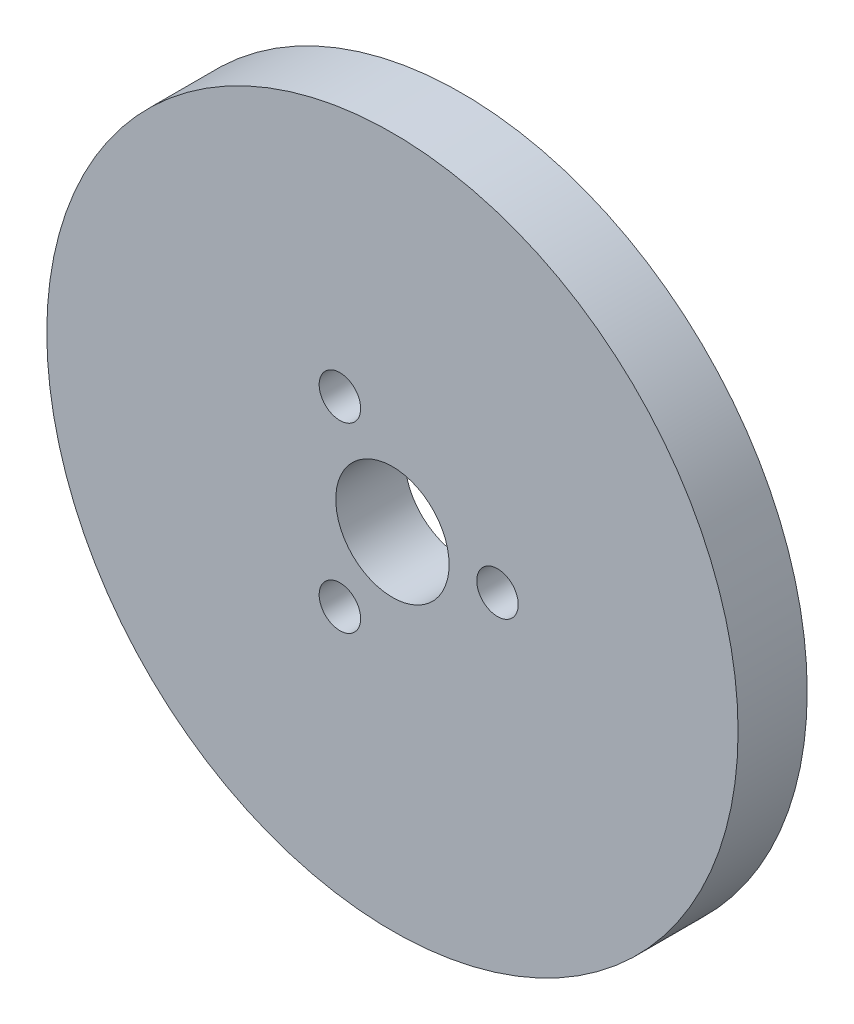
ISO-10303-21;
HEADER;
FILE_DESCRIPTION(('STEP AP214'),'2;1');
FILE_NAME('part.step','',(''),(''),'','','');
FILE_SCHEMA(('AUTOMOTIVE_DESIGN { 1 0 10303 214 1 1 1 1 }'));
ENDSEC;
DATA;
#1=APPLICATION_CONTEXT('core data for automotive mechanical design processes');
#2=APPLICATION_PROTOCOL_DEFINITION('international standard','automotive_design',2000,#1);
#3=PRODUCT_CONTEXT('',#1,'mechanical');
#4=PRODUCT('Part','Part','',(#3));
#5=PRODUCT_RELATED_PRODUCT_CATEGORY('part','',(#4));
#6=PRODUCT_DEFINITION_FORMATION('','',#4);
#7=PRODUCT_DEFINITION_CONTEXT('part definition',#1,'design');
#8=PRODUCT_DEFINITION('design','',#6,#7);
#9=PRODUCT_DEFINITION_SHAPE('','',#8);
#10=(LENGTH_UNIT() NAMED_UNIT(*) SI_UNIT(.MILLI.,.METRE.));
#11=(NAMED_UNIT(*) PLANE_ANGLE_UNIT() SI_UNIT($,.RADIAN.));
#12=(NAMED_UNIT(*) SI_UNIT($,.STERADIAN.) SOLID_ANGLE_UNIT());
#13=UNCERTAINTY_MEASURE_WITH_UNIT(LENGTH_MEASURE(1.E-05),#10,'distance_accuracy_value','');
#14=(GEOMETRIC_REPRESENTATION_CONTEXT(3) GLOBAL_UNCERTAINTY_ASSIGNED_CONTEXT((#13)) GLOBAL_UNIT_ASSIGNED_CONTEXT((#10,
#11,#12)) REPRESENTATION_CONTEXT('',''));
#15=CARTESIAN_POINT('',(0.,0.,0.));
#16=DIRECTION('',(0.,0.,1.));
#17=DIRECTION('',(1.,0.,0.));
#18=AXIS2_PLACEMENT_3D('',#15,#16,#17);
#19=CARTESIAN_POINT('',(-25.4441334366912,-11.5004582691866,26.2397640488421));
#20=DIRECTION('',(0.,0.,1.));
#21=DIRECTION('',(1.,0.,0.));
#22=AXIS2_PLACEMENT_3D('',#19,#20,#21);
#23=PLANE('',#22);
#24=CARTESIAN_POINT('',(-29.2441334366912,-18.0822513379484,26.2397640488421));
#25=DIRECTION('',(0.,0.,1.));
#26=DIRECTION('',(1.,0.,0.));
#27=AXIS2_PLACEMENT_3D('',#24,#25,#26);
#28=CIRCLE('',#27,1.49999999999996);
#29=CARTESIAN_POINT('',(-27.7441334366912,-18.0822513379484,26.2397640488421));
#30=VERTEX_POINT('',#29);
#31=EDGE_CURVE('E47',#30,#30,#28,.T.);
#32=ORIENTED_EDGE('',*,*,#31,.F.);
#33=EDGE_LOOP('',(#32));
#34=FACE_BOUND('',#33,.T.);
#35=CARTESIAN_POINT('',(-25.4441334366912,-11.5004582691866,26.2397640488421));
#36=DIRECTION('',(0.,0.,1.));
#37=DIRECTION('',(1.,0.,0.));
#38=AXIS2_PLACEMENT_3D('',#35,#36,#37);
#39=CIRCLE('',#38,4.1);
#40=CARTESIAN_POINT('',(-21.3441334366912,-11.5004582691866,26.2397640488421));
#41=VERTEX_POINT('',#40);
#42=EDGE_CURVE('E10',#41,#41,#39,.T.);
#43=ORIENTED_EDGE('',*,*,#42,.F.);
#44=EDGE_LOOP('',(#43));
#45=FACE_BOUND('',#44,.T.);
#46=CARTESIAN_POINT('',(-17.8441334366912,-11.5004582691866,26.2397640488421));
#47=DIRECTION('',(0.,0.,1.));
#48=DIRECTION('',(1.,0.,0.));
#49=AXIS2_PLACEMENT_3D('',#46,#47,#48);
#50=CIRCLE('',#49,1.5);
#51=CARTESIAN_POINT('',(-16.3441334366912,-11.5004582691866,26.2397640488421));
#52=VERTEX_POINT('',#51);
#53=EDGE_CURVE('E42',#52,#52,#50,.T.);
#54=ORIENTED_EDGE('',*,*,#53,.F.);
#55=EDGE_LOOP('',(#54));
#56=FACE_BOUND('',#55,.T.);
#57=CARTESIAN_POINT('',(-29.2441334366911,-4.91866520042485,26.2397640488421));
#58=DIRECTION('',(0.,0.,1.));
#59=DIRECTION('',(1.,0.,0.));
#60=AXIS2_PLACEMENT_3D('',#57,#58,#59);
#61=CIRCLE('',#60,1.5);
#62=CARTESIAN_POINT('',(-27.7441334366911,-4.91866520042485,26.2397640488421));
#63=VERTEX_POINT('',#62);
#64=EDGE_CURVE('E53',#63,#63,#61,.T.);
#65=ORIENTED_EDGE('',*,*,#64,.F.);
#66=EDGE_LOOP('',(#65));
#67=FACE_BOUND('',#66,.T.);
#68=CARTESIAN_POINT('',(-25.4441334366912,-11.5004582691866,26.2397640488421));
#69=DIRECTION('',(0.,0.,1.));
#70=DIRECTION('',(1.,0.,0.));
#71=AXIS2_PLACEMENT_3D('',#68,#69,#70);
#72=CIRCLE('',#71,25.);
#73=CARTESIAN_POINT('',(-0.444133436691162,-11.5004582691866,26.2397640488421));
#74=VERTEX_POINT('',#73);
#75=EDGE_CURVE('E59',#74,#74,#72,.T.);
#76=ORIENTED_EDGE('',*,*,#75,.T.);
#77=EDGE_LOOP('',(#76));
#78=FACE_BOUND('',#77,.T.);
#79=ADVANCED_FACE('F31',(#34,#45,#56,#67,#78),#23,.T.);
#80=CARTESIAN_POINT('',(-25.4441334366912,-11.5004582691866,21.2397640488421));
#81=DIRECTION('',(0.,0.,1.));
#82=DIRECTION('',(1.,0.,0.));
#83=AXIS2_PLACEMENT_3D('',#80,#81,#82);
#84=PLANE('',#83);
#85=CARTESIAN_POINT('',(-25.4441334366912,-11.5004582691866,21.2397640488421));
#86=DIRECTION('',(0.,0.,1.));
#87=DIRECTION('',(1.,0.,0.));
#88=AXIS2_PLACEMENT_3D('',#85,#86,#87);
#89=CIRCLE('',#88,4.1);
#90=CARTESIAN_POINT('',(-21.3441334366912,-11.5004582691866,21.2397640488421));
#91=VERTEX_POINT('',#90);
#92=EDGE_CURVE('E35',#91,#91,#89,.T.);
#93=ORIENTED_EDGE('',*,*,#92,.T.);
#94=EDGE_LOOP('',(#93));
#95=FACE_BOUND('',#94,.T.);
#96=CARTESIAN_POINT('',(-17.8441334366912,-11.5004582691866,21.2397640488421));
#97=DIRECTION('',(0.,0.,1.));
#98=DIRECTION('',(1.,0.,0.));
#99=AXIS2_PLACEMENT_3D('',#96,#97,#98);
#100=CIRCLE('',#99,1.5);
#101=CARTESIAN_POINT('',(-16.3441334366912,-11.5004582691866,21.2397640488421));
#102=VERTEX_POINT('',#101);
#103=EDGE_CURVE('E44',#102,#102,#100,.T.);
#104=ORIENTED_EDGE('',*,*,#103,.T.);
#105=EDGE_LOOP('',(#104));
#106=FACE_BOUND('',#105,.T.);
#107=CARTESIAN_POINT('',(-29.2441334366912,-18.0822513379484,21.2397640488421));
#108=DIRECTION('',(0.,0.,1.));
#109=DIRECTION('',(1.,0.,0.));
#110=AXIS2_PLACEMENT_3D('',#107,#108,#109);
#111=CIRCLE('',#110,1.49999999999996);
#112=CARTESIAN_POINT('',(-27.7441334366912,-18.0822513379484,21.2397640488421));
#113=VERTEX_POINT('',#112);
#114=EDGE_CURVE('E50',#113,#113,#111,.T.);
#115=ORIENTED_EDGE('',*,*,#114,.T.);
#116=EDGE_LOOP('',(#115));
#117=FACE_BOUND('',#116,.T.);
#118=CARTESIAN_POINT('',(-29.2441334366911,-4.91866520042485,21.2397640488421));
#119=DIRECTION('',(0.,0.,1.));
#120=DIRECTION('',(1.,0.,0.));
#121=AXIS2_PLACEMENT_3D('',#118,#119,#120);
#122=CIRCLE('',#121,1.5);
#123=CARTESIAN_POINT('',(-27.7441334366911,-4.91866520042485,21.2397640488421));
#124=VERTEX_POINT('',#123);
#125=EDGE_CURVE('E56',#124,#124,#122,.T.);
#126=ORIENTED_EDGE('',*,*,#125,.T.);
#127=EDGE_LOOP('',(#126));
#128=FACE_BOUND('',#127,.T.);
#129=CARTESIAN_POINT('',(-25.4441334366912,-11.5004582691866,21.2397640488421));
#130=DIRECTION('',(0.,0.,1.));
#131=DIRECTION('',(1.,0.,0.));
#132=AXIS2_PLACEMENT_3D('',#129,#130,#131);
#133=CIRCLE('',#132,25.);
#134=CARTESIAN_POINT('',(-0.444133436691162,-11.5004582691866,21.2397640488421));
#135=VERTEX_POINT('',#134);
#136=EDGE_CURVE('E62',#135,#135,#133,.T.);
#137=ORIENTED_EDGE('',*,*,#136,.F.);
#138=EDGE_LOOP('',(#137));
#139=FACE_BOUND('',#138,.T.);
#140=ADVANCED_FACE('F33',(#95,#106,#117,#128,#139),#84,.F.);
#141=CARTESIAN_POINT('',(-25.4441334366912,-11.5004582691866,26.2397640488421));
#142=DIRECTION('',(0.,0.,-1.));
#143=DIRECTION('',(-1.,0.,0.));
#144=AXIS2_PLACEMENT_3D('',#141,#142,#143);
#145=CYLINDRICAL_SURFACE('',#144,4.1);
#146=ORIENTED_EDGE('',*,*,#42,.T.);
#147=EDGE_LOOP('',(#146));
#148=FACE_BOUND('',#147,.T.);
#149=ORIENTED_EDGE('',*,*,#92,.F.);
#150=EDGE_LOOP('',(#149));
#151=FACE_BOUND('',#150,.T.);
#152=ADVANCED_FACE('F86',(#148,#151),#145,.F.);
#153=CARTESIAN_POINT('',(-17.8441334366912,-11.5004582691866,26.2397640488421));
#154=DIRECTION('',(0.,0.,-1.));
#155=DIRECTION('',(-1.,0.,0.));
#156=AXIS2_PLACEMENT_3D('',#153,#154,#155);
#157=CYLINDRICAL_SURFACE('',#156,1.5);
#158=ORIENTED_EDGE('',*,*,#53,.T.);
#159=EDGE_LOOP('',(#158));
#160=FACE_BOUND('',#159,.T.);
#161=ORIENTED_EDGE('',*,*,#103,.F.);
#162=EDGE_LOOP('',(#161));
#163=FACE_BOUND('',#162,.T.);
#164=ADVANCED_FACE('F93',(#160,#163),#157,.F.);
#165=CARTESIAN_POINT('',(-29.2441334366912,-18.0822513379484,26.2397640488421));
#166=DIRECTION('',(0.,0.,-1.));
#167=DIRECTION('',(-1.,0.,0.));
#168=AXIS2_PLACEMENT_3D('',#165,#166,#167);
#169=CYLINDRICAL_SURFACE('',#168,1.49999999999996);
#170=ORIENTED_EDGE('',*,*,#31,.T.);
#171=EDGE_LOOP('',(#170));
#172=FACE_BOUND('',#171,.T.);
#173=ORIENTED_EDGE('',*,*,#114,.F.);
#174=EDGE_LOOP('',(#173));
#175=FACE_BOUND('',#174,.T.);
#176=ADVANCED_FACE('F78',(#172,#175),#169,.F.);
#177=CARTESIAN_POINT('',(-29.2441334366911,-4.91866520042485,26.2397640488421));
#178=DIRECTION('',(0.,0.,-1.));
#179=DIRECTION('',(-1.,0.,0.));
#180=AXIS2_PLACEMENT_3D('',#177,#178,#179);
#181=CYLINDRICAL_SURFACE('',#180,1.5);
#182=ORIENTED_EDGE('',*,*,#64,.T.);
#183=EDGE_LOOP('',(#182));
#184=FACE_BOUND('',#183,.T.);
#185=ORIENTED_EDGE('',*,*,#125,.F.);
#186=EDGE_LOOP('',(#185));
#187=FACE_BOUND('',#186,.T.);
#188=ADVANCED_FACE('F71',(#184,#187),#181,.F.);
#189=CARTESIAN_POINT('',(-25.4441334366912,-11.5004582691866,96.9504421674968));
#190=DIRECTION('',(0.,0.,-1.));
#191=DIRECTION('',(-1.,0.,0.));
#192=AXIS2_PLACEMENT_3D('',#189,#190,#191);
#193=CYLINDRICAL_SURFACE('',#192,25.);
#194=ORIENTED_EDGE('',*,*,#136,.T.);
#195=EDGE_LOOP('',(#194));
#196=FACE_BOUND('',#195,.T.);
#197=ORIENTED_EDGE('',*,*,#75,.F.);
#198=EDGE_LOOP('',(#197));
#199=FACE_BOUND('',#198,.T.);
#200=ADVANCED_FACE('F69',(#196,#199),#193,.T.);
#201=CLOSED_SHELL('',(#79,#140,#152,#164,#176,#188,#200));
#202=MANIFOLD_SOLID_BREP('B2',#201);
#203=ADVANCED_BREP_SHAPE_REPRESENTATION('',(#18,#202),#14);
#204=SHAPE_DEFINITION_REPRESENTATION(#9,#203);
ENDSEC;
END-ISO-10303-21;
